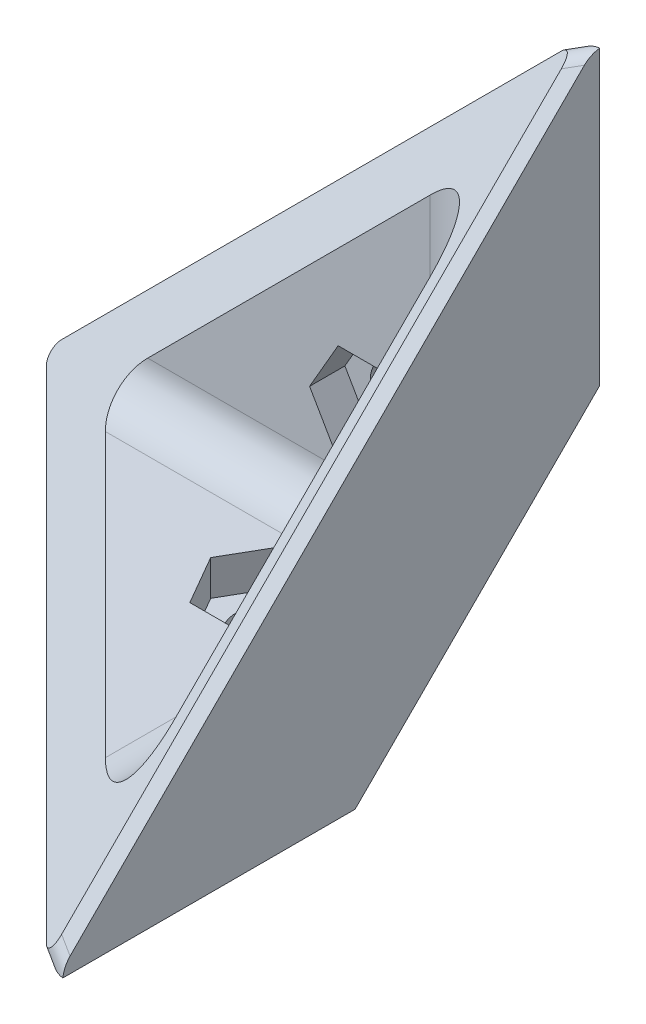
ISO-10303-21;
HEADER;
FILE_DESCRIPTION(('STEP AP214'),'2;1');
FILE_NAME('part.step','',(''),(''),'','','');
FILE_SCHEMA(('AUTOMOTIVE_DESIGN { 1 0 10303 214 1 1 1 1 }'));
ENDSEC;
DATA;
#1=APPLICATION_CONTEXT('core data for automotive mechanical design processes');
#2=APPLICATION_PROTOCOL_DEFINITION('international standard','automotive_design',2000,#1);
#3=PRODUCT_CONTEXT('',#1,'mechanical');
#4=PRODUCT('Part','Part','',(#3));
#5=PRODUCT_RELATED_PRODUCT_CATEGORY('part','',(#4));
#6=PRODUCT_DEFINITION_FORMATION('','',#4);
#7=PRODUCT_DEFINITION_CONTEXT('part definition',#1,'design');
#8=PRODUCT_DEFINITION('design','',#6,#7);
#9=PRODUCT_DEFINITION_SHAPE('','',#8);
#10=(LENGTH_UNIT() NAMED_UNIT(*) SI_UNIT(.MILLI.,.METRE.));
#11=(NAMED_UNIT(*) PLANE_ANGLE_UNIT() SI_UNIT($,.RADIAN.));
#12=(NAMED_UNIT(*) SI_UNIT($,.STERADIAN.) SOLID_ANGLE_UNIT());
#13=UNCERTAINTY_MEASURE_WITH_UNIT(LENGTH_MEASURE(1.E-05),#10,'distance_accuracy_value','');
#14=(GEOMETRIC_REPRESENTATION_CONTEXT(3) GLOBAL_UNCERTAINTY_ASSIGNED_CONTEXT((#13)) GLOBAL_UNIT_ASSIGNED_CONTEXT((#10,
#11,#12)) REPRESENTATION_CONTEXT('',''));
#15=CARTESIAN_POINT('',(0.,0.,0.));
#16=DIRECTION('',(0.,0.,1.));
#17=DIRECTION('',(1.,0.,0.));
#18=AXIS2_PLACEMENT_3D('',#15,#16,#17);
#19=CARTESIAN_POINT('',(-11.5,5.,12.));
#20=DIRECTION('',(0.,1.,0.));
#21=DIRECTION('',(0.,0.,1.));
#22=AXIS2_PLACEMENT_3D('',#19,#20,#21);
#23=CYLINDRICAL_SURFACE('',#22,2.25);
#24=CARTESIAN_POINT('',(-11.5,0.,12.));
#25=DIRECTION('',(0.,-1.,0.));
#26=DIRECTION('',(0.,0.,-1.));
#27=AXIS2_PLACEMENT_3D('',#24,#25,#26);
#28=CIRCLE('',#27,2.25);
#29=CARTESIAN_POINT('',(-11.5,0.,9.75));
#30=VERTEX_POINT('',#29);
#31=EDGE_CURVE('E291',#30,#30,#28,.T.);
#32=ORIENTED_EDGE('',*,*,#31,.T.);
#33=EDGE_LOOP('',(#32));
#34=FACE_BOUND('',#33,.T.);
#35=CARTESIAN_POINT('',(-11.5,2.5,12.));
#36=DIRECTION('',(0.,1.,0.));
#37=DIRECTION('',(0.,0.,1.));
#38=AXIS2_PLACEMENT_3D('',#35,#36,#37);
#39=CIRCLE('',#38,2.25);
#40=CARTESIAN_POINT('',(-11.5,2.5,14.25));
#41=VERTEX_POINT('',#40);
#42=EDGE_CURVE('E282',#41,#41,#39,.F.);
#43=ORIENTED_EDGE('',*,*,#42,.F.);
#44=EDGE_LOOP('',(#43));
#45=FACE_BOUND('',#44,.T.);
#46=ADVANCED_FACE('F52',(#34,#45),#23,.F.);
#47=CARTESIAN_POINT('',(-2.,0.,0.));
#48=DIRECTION('',(1.,0.,0.));
#49=DIRECTION('',(0.,0.,-1.));
#50=AXIS2_PLACEMENT_3D('',#47,#48,#49);
#51=PLANE('',#50);
#52=DIRECTION('',(0.,1.,0.));
#53=VECTOR('',#52,1.);
#54=CARTESIAN_POINT('',(-2.,13.7846096908265,10.));
#55=LINE('',#54,#53);
#56=CARTESIAN_POINT('',(-2.,28.,10.));
#57=VERTEX_POINT('',#56);
#58=CARTESIAN_POINT('',(-2.,10.,10.));
#59=VERTEX_POINT('',#58);
#60=EDGE_CURVE('E648',#57,#59,#55,.F.);
#61=ORIENTED_EDGE('',*,*,#60,.T.);
#62=DIRECTION('',(0.,0.,-1.));
#63=VECTOR('',#62,1.);
#64=CARTESIAN_POINT('',(-2.,10.,33.));
#65=LINE('',#64,#63);
#66=CARTESIAN_POINT('',(-2.,10.,28.));
#67=VERTEX_POINT('',#66);
#68=EDGE_CURVE('E647',#59,#67,#65,.F.);
#69=ORIENTED_EDGE('',*,*,#68,.T.);
#70=DIRECTION('',(0.,-0.707106781186548,0.707106781186547));
#71=VECTOR('',#70,1.);
#72=CARTESIAN_POINT('',(-2.,19.,19.));
#73=LINE('',#72,#71);
#74=EDGE_CURVE('E363',#57,#67,#73,.T.);
#75=ORIENTED_EDGE('',*,*,#74,.F.);
#76=EDGE_LOOP('',(#61,#69,#75));
#77=FACE_BOUND('',#76,.T.);
#78=ADVANCED_FACE('F458',(#77),#51,.F.);
#79=CARTESIAN_POINT('',(0.,0.,5.));
#80=DIRECTION('',(0.,0.,-1.));
#81=DIRECTION('',(-1.,0.,0.));
#82=AXIS2_PLACEMENT_3D('',#79,#80,#81);
#83=PLANE('',#82);
#84=DIRECTION('',(0.5,-0.866025403784439,0.));
#85=VECTOR('',#84,1.);
#86=CARTESIAN_POINT('',(-15.5414518843274,12.,5.));
#87=LINE('',#86,#85);
#88=CARTESIAN_POINT('',(-15.5414518843274,12.,5.));
#89=VERTEX_POINT('',#88);
#90=CARTESIAN_POINT('',(-13.5207259421637,8.5,5.));
#91=VERTEX_POINT('',#90);
#92=EDGE_CURVE('E331',#89,#91,#87,.T.);
#93=ORIENTED_EDGE('',*,*,#92,.F.);
#94=DIRECTION('',(-0.5,-0.866025403784439,0.));
#95=VECTOR('',#94,1.);
#96=CARTESIAN_POINT('',(-13.5207259421637,15.5,5.));
#97=LINE('',#96,#95);
#98=CARTESIAN_POINT('',(-13.5207259421637,15.5,5.));
#99=VERTEX_POINT('',#98);
#100=EDGE_CURVE('E315',#99,#89,#97,.T.);
#101=ORIENTED_EDGE('',*,*,#100,.F.);
#102=DIRECTION('',(-1.,0.,0.));
#103=VECTOR('',#102,1.);
#104=CARTESIAN_POINT('',(-9.47927405783631,15.5,5.));
#105=LINE('',#104,#103);
#106=CARTESIAN_POINT('',(-9.47927405783631,15.5,5.));
#107=VERTEX_POINT('',#106);
#108=EDGE_CURVE('E320',#107,#99,#105,.T.);
#109=ORIENTED_EDGE('',*,*,#108,.F.);
#110=DIRECTION('',(-0.5,0.866025403784439,0.));
#111=VECTOR('',#110,1.);
#112=CARTESIAN_POINT('',(-7.45854811567262,12.,5.));
#113=LINE('',#112,#111);
#114=CARTESIAN_POINT('',(-7.45854811567262,12.,5.));
#115=VERTEX_POINT('',#114);
#116=EDGE_CURVE('E345',#115,#107,#113,.T.);
#117=ORIENTED_EDGE('',*,*,#116,.F.);
#118=DIRECTION('',(0.5,0.866025403784439,0.));
#119=VECTOR('',#118,1.);
#120=CARTESIAN_POINT('',(-9.47927405783631,8.5,5.));
#121=LINE('',#120,#119);
#122=CARTESIAN_POINT('',(-9.47927405783631,8.5,5.));
#123=VERTEX_POINT('',#122);
#124=EDGE_CURVE('E338',#123,#115,#121,.T.);
#125=ORIENTED_EDGE('',*,*,#124,.F.);
#126=DIRECTION('',(1.,0.,0.));
#127=VECTOR('',#126,1.);
#128=CARTESIAN_POINT('',(-13.5207259421637,8.5,5.));
#129=LINE('',#128,#127);
#130=EDGE_CURVE('E340',#91,#123,#129,.T.);
#131=ORIENTED_EDGE('',*,*,#130,.F.);
#132=EDGE_LOOP('',(#93,#101,#109,#117,#125,#131));
#133=FACE_BOUND('',#132,.T.);
#134=DIRECTION('',(-0.707106781186548,-0.707106781186548,0.));
#135=VECTOR('',#134,1.);
#136=CARTESIAN_POINT('',(2.50000000000001,37.5,5.));
#137=LINE('',#136,#135);
#138=CARTESIAN_POINT('',(-7.,28.,5.));
#139=VERTEX_POINT('',#138);
#140=CARTESIAN_POINT('',(-27.,8.,5.));
#141=VERTEX_POINT('',#140);
#142=EDGE_CURVE('E349',#139,#141,#137,.T.);
#143=ORIENTED_EDGE('',*,*,#142,.T.);
#144=DIRECTION('',(1.,0.,0.));
#145=VECTOR('',#144,1.);
#146=CARTESIAN_POINT('',(-10.7846096908265,8.,5.));
#147=LINE('',#146,#145);
#148=CARTESIAN_POINT('',(-7.78460969082653,8.,5.));
#149=VERTEX_POINT('',#148);
#150=EDGE_CURVE('E634',#141,#149,#147,.T.);
#151=ORIENTED_EDGE('',*,*,#150,.T.);
#152=DIRECTION('',(-0.707106781186548,-0.707106781186548,0.));
#153=VECTOR('',#152,1.);
#154=CARTESIAN_POINT('',(-7.89230484541326,7.89230484541326,5.));
#155=LINE('',#154,#153);
#156=CARTESIAN_POINT('',(-7.,8.78460969082653,5.));
#157=VERTEX_POINT('',#156);
#158=EDGE_CURVE('E293',#157,#149,#155,.T.);
#159=ORIENTED_EDGE('',*,*,#158,.F.);
#160=DIRECTION('',(0.,1.,0.));
#161=VECTOR('',#160,1.);
#162=CARTESIAN_POINT('',(-7.,33.,5.));
#163=LINE('',#162,#161);
#164=EDGE_CURVE('E644',#157,#139,#163,.T.);
#165=ORIENTED_EDGE('',*,*,#164,.T.);
#166=EDGE_LOOP('',(#143,#151,#159,#165));
#167=FACE_BOUND('',#166,.T.);
#168=ADVANCED_FACE('F453',(#133,#167),#83,.F.);
#169=CARTESIAN_POINT('',(-40.,5.,0.));
#170=DIRECTION('',(0.,-1.,0.));
#171=DIRECTION('',(1.,0.,0.));
#172=AXIS2_PLACEMENT_3D('',#169,#170,#171);
#173=PLANE('',#172);
#174=DIRECTION('',(0.500000000000001,0.,0.866025403784438));
#175=VECTOR('',#174,1.);
#176=CARTESIAN_POINT('',(-15.5414518843274,5.,12.));
#177=LINE('',#176,#175);
#178=CARTESIAN_POINT('',(-15.5414518843274,5.,12.));
#179=VERTEX_POINT('',#178);
#180=CARTESIAN_POINT('',(-13.5207259421637,5.,15.5));
#181=VERTEX_POINT('',#180);
#182=EDGE_CURVE('E268',#179,#181,#177,.T.);
#183=ORIENTED_EDGE('',*,*,#182,.F.);
#184=DIRECTION('',(-0.5,0.,0.866025403784438));
#185=VECTOR('',#184,1.);
#186=CARTESIAN_POINT('',(-13.5207259421637,5.,8.5));
#187=LINE('',#186,#185);
#188=CARTESIAN_POINT('',(-13.5207259421637,5.,8.5));
#189=VERTEX_POINT('',#188);
#190=EDGE_CURVE('E240',#189,#179,#187,.T.);
#191=ORIENTED_EDGE('',*,*,#190,.F.);
#192=DIRECTION('',(-1.,0.,0.));
#193=VECTOR('',#192,1.);
#194=CARTESIAN_POINT('',(-9.47927405783631,5.,8.5));
#195=LINE('',#194,#193);
#196=CARTESIAN_POINT('',(-9.47927405783631,5.,8.5));
#197=VERTEX_POINT('',#196);
#198=EDGE_CURVE('E257',#197,#189,#195,.T.);
#199=ORIENTED_EDGE('',*,*,#198,.F.);
#200=DIRECTION('',(-0.5,0.,-0.866025403784438));
#201=VECTOR('',#200,1.);
#202=CARTESIAN_POINT('',(-7.45854811567262,5.,12.));
#203=LINE('',#202,#201);
#204=CARTESIAN_POINT('',(-7.45854811567262,5.,12.));
#205=VERTEX_POINT('',#204);
#206=EDGE_CURVE('E256',#205,#197,#203,.T.);
#207=ORIENTED_EDGE('',*,*,#206,.F.);
#208=DIRECTION('',(0.5,0.,-0.866025403784439));
#209=VECTOR('',#208,1.);
#210=CARTESIAN_POINT('',(-9.47927405783631,5.,15.5));
#211=LINE('',#210,#209);
#212=CARTESIAN_POINT('',(-9.47927405783631,5.,15.5));
#213=VERTEX_POINT('',#212);
#214=EDGE_CURVE('E277',#213,#205,#211,.T.);
#215=ORIENTED_EDGE('',*,*,#214,.F.);
#216=DIRECTION('',(1.,0.,0.));
#217=VECTOR('',#216,1.);
#218=CARTESIAN_POINT('',(-13.5207259421637,5.,15.5));
#219=LINE('',#218,#217);
#220=EDGE_CURVE('E271',#181,#213,#219,.T.);
#221=ORIENTED_EDGE('',*,*,#220,.F.);
#222=EDGE_LOOP('',(#183,#191,#199,#207,#215,#221));
#223=FACE_BOUND('',#222,.T.);
#224=DIRECTION('',(0.707106781186548,0.,0.707106781186547));
#225=VECTOR('',#224,1.);
#226=CARTESIAN_POINT('',(-27.8923048454133,5.,-12.1076951545867));
#227=LINE('',#226,#225);
#228=CARTESIAN_POINT('',(-7.78460969082652,5.,8.));
#229=VERTEX_POINT('',#228);
#230=CARTESIAN_POINT('',(-7.,5.,8.78460969082652));
#231=VERTEX_POINT('',#230);
#232=EDGE_CURVE('E668',#229,#231,#227,.T.);
#233=ORIENTED_EDGE('',*,*,#232,.F.);
#234=DIRECTION('',(1.,0.,0.));
#235=VECTOR('',#234,1.);
#236=CARTESIAN_POINT('',(-30.,5.,8.));
#237=LINE('',#236,#235);
#238=CARTESIAN_POINT('',(-27.,5.,8.));
#239=VERTEX_POINT('',#238);
#240=EDGE_CURVE('E62',#229,#239,#237,.F.);
#241=ORIENTED_EDGE('',*,*,#240,.T.);
#242=DIRECTION('',(0.707106781186548,0.,0.707106781186547));
#243=VECTOR('',#242,1.);
#244=CARTESIAN_POINT('',(-17.5,5.,17.5));
#245=LINE('',#244,#243);
#246=CARTESIAN_POINT('',(-7.,5.,28.));
#247=VERTEX_POINT('',#246);
#248=EDGE_CURVE('E362',#239,#247,#245,.T.);
#249=ORIENTED_EDGE('',*,*,#248,.T.);
#250=DIRECTION('',(0.,0.,-1.));
#251=VECTOR('',#250,1.);
#252=CARTESIAN_POINT('',(-7.,5.,13.7846096908265));
#253=LINE('',#252,#251);
#254=EDGE_CURVE('E669',#247,#231,#253,.T.);
#255=ORIENTED_EDGE('',*,*,#254,.T.);
#256=EDGE_LOOP('',(#233,#241,#249,#255));
#257=FACE_BOUND('',#256,.T.);
#258=ADVANCED_FACE('F399',(#223,#257),#173,.F.);
#259=CARTESIAN_POINT('',(0.,0.,0.));
#260=DIRECTION('',(1.,0.,0.));
#261=DIRECTION('',(0.,0.,-1.));
#262=AXIS2_PLACEMENT_3D('',#259,#260,#261);
#263=PLANE('',#262);
#264=DIRECTION('',(0.,-0.707106781186548,0.707106781186547));
#265=VECTOR('',#264,1.);
#266=CARTESIAN_POINT('',(0.,19.2928932188134,19.2928932188134));
#267=LINE('',#266,#265);
#268=CARTESIAN_POINT('',(0.,37.4981225640463,1.08766387358053));
#269=VERTEX_POINT('',#268);
#270=CARTESIAN_POINT('',(0.,1.08766387358053,37.4981225640463));
#271=VERTEX_POINT('',#270);
#272=EDGE_CURVE('E699',#269,#271,#267,.T.);
#273=ORIENTED_EDGE('',*,*,#272,.T.);
#274=CARTESIAN_POINT('',(0.,0.,36.9933360035906));
#275=DIRECTION('',(1.,0.,0.));
#276=DIRECTION('',(0.,0.965925826289069,-0.258819045102518));
#277=AXIS2_PLACEMENT_3D('',#274,#275,#276);
#278=ELLIPSE('',#277,1.43937374219641,1.);
#279=CARTESIAN_POINT('',(0.,0.,38.0111269373595));
#280=VERTEX_POINT('',#279);
#281=EDGE_CURVE('E429',#271,#280,#278,.T.);
#282=ORIENTED_EDGE('',*,*,#281,.T.);
#283=DIRECTION('',(0.,0.,-1.));
#284=VECTOR('',#283,1.);
#285=CARTESIAN_POINT('',(0.,0.,40.));
#286=LINE('',#285,#284);
#287=CARTESIAN_POINT('',(0.,0.,17.3205080756888));
#288=VERTEX_POINT('',#287);
#289=EDGE_CURVE('E418',#280,#288,#286,.T.);
#290=ORIENTED_EDGE('',*,*,#289,.T.);
#291=DIRECTION('',(0.,-0.707106781186548,0.707106781186547));
#292=VECTOR('',#291,1.);
#293=CARTESIAN_POINT('',(0.,8.66025403784438,8.66025403784439));
#294=LINE('',#293,#292);
#295=CARTESIAN_POINT('',(0.,17.3205080756888,0.));
#296=VERTEX_POINT('',#295);
#297=EDGE_CURVE('E301',#296,#288,#294,.T.);
#298=ORIENTED_EDGE('',*,*,#297,.F.);
#299=DIRECTION('',(0.,1.,0.));
#300=VECTOR('',#299,1.);
#301=CARTESIAN_POINT('',(0.,0.,0.));
#302=LINE('',#301,#300);
#303=CARTESIAN_POINT('',(0.,38.0111269373596,0.));
#304=VERTEX_POINT('',#303);
#305=EDGE_CURVE('E684',#296,#304,#302,.T.);
#306=ORIENTED_EDGE('',*,*,#305,.T.);
#307=CARTESIAN_POINT('',(0.,36.9933360035906,0.));
#308=DIRECTION('',(1.,0.,0.));
#309=DIRECTION('',(0.,-0.258819045102517,0.96592582628907));
#310=AXIS2_PLACEMENT_3D('',#307,#308,#309);
#311=ELLIPSE('',#310,1.43937374219641,1.);
#312=EDGE_CURVE('E430',#304,#269,#311,.T.);
#313=ORIENTED_EDGE('',*,*,#312,.T.);
#314=EDGE_LOOP('',(#273,#282,#290,#298,#306,#313));
#315=FACE_BOUND('',#314,.T.);
#316=ADVANCED_FACE('F391',(#315),#263,.T.);
#317=CARTESIAN_POINT('',(0.,0.,0.));
#318=DIRECTION('',(0.,0.,-1.));
#319=DIRECTION('',(-1.,0.,0.));
#320=AXIS2_PLACEMENT_3D('',#317,#318,#319);
#321=PLANE('',#320);
#322=DIRECTION('',(1.,0.,0.));
#323=VECTOR('',#322,1.);
#324=CARTESIAN_POINT('',(0.,0.,0.));
#325=LINE('',#324,#323);
#326=CARTESIAN_POINT('',(-38.0111269373596,0.,0.));
#327=VERTEX_POINT('',#326);
#328=CARTESIAN_POINT('',(-17.3205080756888,0.,0.));
#329=VERTEX_POINT('',#328);
#330=EDGE_CURVE('E364',#327,#329,#325,.T.);
#331=ORIENTED_EDGE('',*,*,#330,.F.);
#332=CARTESIAN_POINT('',(-36.9933360035906,0.,0.));
#333=DIRECTION('',(0.,0.,-1.));
#334=DIRECTION('',(-0.258819045102525,-0.965925826289067,0.));
#335=AXIS2_PLACEMENT_3D('',#332,#333,#334);
#336=ELLIPSE('',#335,1.43937374219641,1.);
#337=CARTESIAN_POINT('',(-37.4981225640464,1.08766387358053,0.));
#338=VERTEX_POINT('',#337);
#339=EDGE_CURVE('E686',#327,#338,#336,.T.);
#340=ORIENTED_EDGE('',*,*,#339,.T.);
#341=DIRECTION('',(0.707106781186548,0.707106781186548,0.));
#342=VECTOR('',#341,1.);
#343=CARTESIAN_POINT('',(-19.2928932188134,19.2928932188134,0.));
#344=LINE('',#343,#342);
#345=CARTESIAN_POINT('',(-1.08766387358054,37.4981225640463,0.));
#346=VERTEX_POINT('',#345);
#347=EDGE_CURVE('E694',#338,#346,#344,.T.);
#348=ORIENTED_EDGE('',*,*,#347,.T.);
#349=CARTESIAN_POINT('',(0.,36.9933360035906,0.));
#350=DIRECTION('',(0.,0.,-1.));
#351=DIRECTION('',(-0.965925826289069,-0.258819045102518,0.));
#352=AXIS2_PLACEMENT_3D('',#349,#350,#351);
#353=ELLIPSE('',#352,1.4393737421964,1.);
#354=EDGE_CURVE('E695',#346,#304,#353,.T.);
#355=ORIENTED_EDGE('',*,*,#354,.T.);
#356=ORIENTED_EDGE('',*,*,#305,.F.);
#357=DIRECTION('',(0.707106781186548,0.707106781186548,0.));
#358=VECTOR('',#357,1.);
#359=CARTESIAN_POINT('',(-8.66025403784439,8.66025403784439,0.));
#360=LINE('',#359,#358);
#361=EDGE_CURVE('E300',#329,#296,#360,.T.);
#362=ORIENTED_EDGE('',*,*,#361,.F.);
#363=EDGE_LOOP('',(#331,#340,#348,#355,#356,#362));
#364=FACE_BOUND('',#363,.T.);
#365=CARTESIAN_POINT('',(-11.5,12.,0.));
#366=DIRECTION('',(0.,0.,-1.));
#367=DIRECTION('',(-1.,0.,0.));
#368=AXIS2_PLACEMENT_3D('',#365,#366,#367);
#369=CIRCLE('',#368,2.25);
#370=CARTESIAN_POINT('',(-13.75,12.,0.));
#371=VERTEX_POINT('',#370);
#372=EDGE_CURVE('E307',#371,#371,#369,.T.);
#373=ORIENTED_EDGE('',*,*,#372,.F.);
#374=EDGE_LOOP('',(#373));
#375=FACE_BOUND('',#374,.T.);
#376=ADVANCED_FACE('F397',(#364,#375),#321,.T.);
#377=CARTESIAN_POINT('',(0.,40.,0.));
#378=DIRECTION('',(-0.577350269189626,0.577350269189626,0.577350269189626));
#379=DIRECTION('',(-0.707106781186547,-0.707106781186547,0.));
#380=AXIS2_PLACEMENT_3D('',#377,#378,#379);
#381=PLANE('',#380);
#382=DIRECTION('',(0.707106781186548,0.,0.707106781186547));
#383=VECTOR('',#382,1.);
#384=CARTESIAN_POINT('',(-19.5917517095361,0.816496580927736,19.5917517095361));
#385=LINE('',#384,#383);
#386=CARTESIAN_POINT('',(-37.279342964564,0.816496580927736,1.90416045450827));
#387=VERTEX_POINT('',#386);
#388=CARTESIAN_POINT('',(-1.90416045450827,0.816496580927736,37.279342964564));
#389=VERTEX_POINT('',#388);
#390=EDGE_CURVE('E712',#387,#389,#385,.T.);
#391=ORIENTED_EDGE('',*,*,#390,.T.);
#392=CARTESIAN_POINT('',(-1.7358982676897,1.73589826768971,36.5282034646206));
#393=DIRECTION('',(-0.577350269189626,0.577350269189626,0.577350269189626));
#394=DIRECTION('',(-0.408248290463858,0.408248290463868,-0.816496580927726));
#395=AXIS2_PLACEMENT_3D('',#392,#393,#394);
#396=ELLIPSE('',#395,1.43937374219641,1.);
#397=CARTESIAN_POINT('',(-0.816496580927736,1.90416045450828,37.279342964564));
#398=VERTEX_POINT('',#397);
#399=EDGE_CURVE('E736',#389,#398,#396,.T.);
#400=ORIENTED_EDGE('',*,*,#399,.T.);
#401=DIRECTION('',(0.,0.707106781186548,-0.707106781186547));
#402=VECTOR('',#401,1.);
#403=CARTESIAN_POINT('',(-0.816496580927736,39.5917517095361,-0.408248290463872));
#404=LINE('',#403,#402);
#405=CARTESIAN_POINT('',(-0.816496580927736,37.279342964564,1.90416045450828));
#406=VERTEX_POINT('',#405);
#407=EDGE_CURVE('E720',#398,#406,#404,.T.);
#408=ORIENTED_EDGE('',*,*,#407,.T.);
#409=CARTESIAN_POINT('',(-1.7358982676897,36.5282034646206,1.7358982676897));
#410=DIRECTION('',(-0.577350269189626,0.577350269189626,0.577350269189626));
#411=DIRECTION('',(-0.40824829046386,-0.816496580927726,0.408248290463866));
#412=AXIS2_PLACEMENT_3D('',#409,#410,#411);
#413=ELLIPSE('',#412,1.4393737421964,1.);
#414=CARTESIAN_POINT('',(-1.90416045450827,37.279342964564,0.816496580927736));
#415=VERTEX_POINT('',#414);
#416=EDGE_CURVE('E735',#406,#415,#413,.T.);
#417=ORIENTED_EDGE('',*,*,#416,.T.);
#418=DIRECTION('',(-0.707106781186548,-0.707106781186548,0.));
#419=VECTOR('',#418,1.);
#420=CARTESIAN_POINT('',(0.408248290463875,39.5917517095361,0.816496580927736));
#421=LINE('',#420,#419);
#422=CARTESIAN_POINT('',(-37.279342964564,1.90416045450827,0.816496580927736));
#423=VERTEX_POINT('',#422);
#424=EDGE_CURVE('E719',#415,#423,#421,.T.);
#425=ORIENTED_EDGE('',*,*,#424,.T.);
#426=CARTESIAN_POINT('',(-36.5282034646206,1.73589826768971,1.7358982676897));
#427=DIRECTION('',(-0.577350269189626,0.577350269189626,0.577350269189626));
#428=DIRECTION('',(-0.816496580927726,-0.408248290463865,-0.408248290463861));
#429=AXIS2_PLACEMENT_3D('',#426,#427,#428);
#430=ELLIPSE('',#429,1.43937374219641,1.);
#431=EDGE_CURVE('E740',#423,#387,#430,.T.);
#432=ORIENTED_EDGE('',*,*,#431,.T.);
#433=EDGE_LOOP('',(#391,#400,#408,#417,#425,#432));
#434=FACE_BOUND('',#433,.T.);
#435=ORIENTED_EDGE('',*,*,#142,.F.);
#436=CARTESIAN_POINT('',(-7.,23.,10.));
#437=DIRECTION('',(-0.577350269189626,0.577350269189626,0.577350269189626));
#438=DIRECTION('',(-0.408248290463863,-0.816496580927726,0.408248290463863));
#439=AXIS2_PLACEMENT_3D('',#436,#437,#438);
#440=ELLIPSE('',#439,8.66025403784439,5.);
#441=EDGE_CURVE('E650',#139,#57,#440,.F.);
#442=ORIENTED_EDGE('',*,*,#441,.T.);
#443=ORIENTED_EDGE('',*,*,#74,.T.);
#444=CARTESIAN_POINT('',(-7.,10.,23.));
#445=DIRECTION('',(-0.577350269189626,0.577350269189626,0.577350269189626));
#446=DIRECTION('',(0.408248290463863,-0.408248290463863,0.816496580927726));
#447=AXIS2_PLACEMENT_3D('',#444,#445,#446);
#448=ELLIPSE('',#447,8.66025403784438,5.);
#449=EDGE_CURVE('E643',#67,#247,#448,.F.);
#450=ORIENTED_EDGE('',*,*,#449,.T.);
#451=ORIENTED_EDGE('',*,*,#248,.F.);
#452=CARTESIAN_POINT('',(-24.,8.,8.));
#453=DIRECTION('',(-0.577350269189626,0.577350269189626,0.577350269189626));
#454=DIRECTION('',(-0.816496580927726,-0.408248290463863,-0.408248290463863));
#455=AXIS2_PLACEMENT_3D('',#452,#453,#454);
#456=ELLIPSE('',#455,5.19615242270663,3.);
#457=EDGE_CURVE('E12',#239,#141,#456,.F.);
#458=ORIENTED_EDGE('',*,*,#457,.T.);
#459=EDGE_LOOP('',(#435,#442,#443,#450,#451,#458));
#460=FACE_BOUND('',#459,.T.);
#461=ADVANCED_FACE('F390',(#434,#460),#381,.T.);
#462=CARTESIAN_POINT('',(-40.,0.,0.));
#463=DIRECTION('',(0.,-1.,0.));
#464=DIRECTION('',(1.,0.,0.));
#465=AXIS2_PLACEMENT_3D('',#462,#463,#464);
#466=PLANE('',#465);
#467=ORIENTED_EDGE('',*,*,#31,.F.);
#468=EDGE_LOOP('',(#467));
#469=FACE_BOUND('',#468,.T.);
#470=ORIENTED_EDGE('',*,*,#289,.F.);
#471=CARTESIAN_POINT('',(0.,0.,36.9933360035906));
#472=DIRECTION('',(0.,-1.,0.));
#473=DIRECTION('',(-0.965925826289068,0.,-0.258819045102521));
#474=AXIS2_PLACEMENT_3D('',#471,#472,#473);
#475=ELLIPSE('',#474,1.4393737421964,1.);
#476=CARTESIAN_POINT('',(-1.08766387358052,0.,37.4981225640463));
#477=VERTEX_POINT('',#476);
#478=EDGE_CURVE('E692',#280,#477,#475,.T.);
#479=ORIENTED_EDGE('',*,*,#478,.T.);
#480=DIRECTION('',(-0.707106781186548,0.,-0.707106781186547));
#481=VECTOR('',#480,1.);
#482=CARTESIAN_POINT('',(-39.2928932188134,0.,-0.707106781186557));
#483=LINE('',#482,#481);
#484=CARTESIAN_POINT('',(-37.4981225640464,0.,1.08766387358053));
#485=VERTEX_POINT('',#484);
#486=EDGE_CURVE('E709',#477,#485,#483,.T.);
#487=ORIENTED_EDGE('',*,*,#486,.T.);
#488=CARTESIAN_POINT('',(-36.9933360035906,0.,0.));
#489=DIRECTION('',(0.,-1.,0.));
#490=DIRECTION('',(-0.258819045102526,0.,-0.965925826289067));
#491=AXIS2_PLACEMENT_3D('',#488,#489,#490);
#492=ELLIPSE('',#491,1.43937374219641,1.);
#493=EDGE_CURVE('E431',#485,#327,#492,.T.);
#494=ORIENTED_EDGE('',*,*,#493,.T.);
#495=ORIENTED_EDGE('',*,*,#330,.T.);
#496=DIRECTION('',(-0.707106781186548,0.,-0.707106781186547));
#497=VECTOR('',#496,1.);
#498=CARTESIAN_POINT('',(-28.6602540378444,0.,-11.3397459621556));
#499=LINE('',#498,#497);
#500=EDGE_CURVE('E295',#288,#329,#499,.T.);
#501=ORIENTED_EDGE('',*,*,#500,.F.);
#502=EDGE_LOOP('',(#470,#479,#487,#494,#495,#501));
#503=FACE_BOUND('',#502,.T.);
#504=ADVANCED_FACE('F380',(#469,#503),#466,.T.);
#505=CARTESIAN_POINT('',(-13.5207259421637,15.5,2.5));
#506=DIRECTION('',(-0.866025403784439,0.5,0.));
#507=DIRECTION('',(-0.5,-0.866025403784439,0.));
#508=AXIS2_PLACEMENT_3D('',#505,#506,#507);
#509=PLANE('',#508);
#510=ORIENTED_EDGE('',*,*,#100,.T.);
#511=DIRECTION('',(0.,0.,1.));
#512=VECTOR('',#511,1.);
#513=CARTESIAN_POINT('',(-15.5414518843274,12.,2.5));
#514=LINE('',#513,#512);
#515=CARTESIAN_POINT('',(-15.5414518843274,12.,2.5));
#516=VERTEX_POINT('',#515);
#517=EDGE_CURVE('E334',#516,#89,#514,.T.);
#518=ORIENTED_EDGE('',*,*,#517,.F.);
#519=DIRECTION('',(-0.5,-0.866025403784439,0.));
#520=VECTOR('',#519,1.);
#521=CARTESIAN_POINT('',(-13.5207259421637,15.5,2.5));
#522=LINE('',#521,#520);
#523=CARTESIAN_POINT('',(-13.5207259421637,15.5,2.5));
#524=VERTEX_POINT('',#523);
#525=EDGE_CURVE('E312',#524,#516,#522,.T.);
#526=ORIENTED_EDGE('',*,*,#525,.F.);
#527=DIRECTION('',(0.,0.,1.));
#528=VECTOR('',#527,1.);
#529=CARTESIAN_POINT('',(-13.5207259421637,15.5,2.5));
#530=LINE('',#529,#528);
#531=EDGE_CURVE('E347',#524,#99,#530,.T.);
#532=ORIENTED_EDGE('',*,*,#531,.T.);
#533=EDGE_LOOP('',(#510,#518,#526,#532));
#534=FACE_BOUND('',#533,.T.);
#535=ADVANCED_FACE('F389',(#534),#509,.F.);
#536=CARTESIAN_POINT('',(-9.47927405783631,15.5,2.5));
#537=DIRECTION('',(0.,1.,0.));
#538=DIRECTION('',(-1.,0.,0.));
#539=AXIS2_PLACEMENT_3D('',#536,#537,#538);
#540=PLANE('',#539);
#541=ORIENTED_EDGE('',*,*,#108,.T.);
#542=ORIENTED_EDGE('',*,*,#531,.F.);
#543=DIRECTION('',(-1.,0.,0.));
#544=VECTOR('',#543,1.);
#545=CARTESIAN_POINT('',(-9.47927405783631,15.5,2.5));
#546=LINE('',#545,#544);
#547=CARTESIAN_POINT('',(-9.47927405783631,15.5,2.5));
#548=VERTEX_POINT('',#547);
#549=EDGE_CURVE('E328',#548,#524,#546,.T.);
#550=ORIENTED_EDGE('',*,*,#549,.F.);
#551=DIRECTION('',(0.,0.,1.));
#552=VECTOR('',#551,1.);
#553=CARTESIAN_POINT('',(-9.47927405783631,15.5,2.5));
#554=LINE('',#553,#552);
#555=EDGE_CURVE('E352',#548,#107,#554,.T.);
#556=ORIENTED_EDGE('',*,*,#555,.T.);
#557=EDGE_LOOP('',(#541,#542,#550,#556));
#558=FACE_BOUND('',#557,.T.);
#559=ADVANCED_FACE('F467',(#558),#540,.F.);
#560=CARTESIAN_POINT('',(-7.45854811567262,12.,2.5));
#561=DIRECTION('',(0.866025403784438,0.5,0.));
#562=DIRECTION('',(-0.5,0.866025403784439,0.));
#563=AXIS2_PLACEMENT_3D('',#560,#561,#562);
#564=PLANE('',#563);
#565=ORIENTED_EDGE('',*,*,#116,.T.);
#566=ORIENTED_EDGE('',*,*,#555,.F.);
#567=DIRECTION('',(-0.5,0.866025403784439,0.));
#568=VECTOR('',#567,1.);
#569=CARTESIAN_POINT('',(-7.45854811567262,12.,2.5));
#570=LINE('',#569,#568);
#571=CARTESIAN_POINT('',(-7.45854811567262,12.,2.5));
#572=VERTEX_POINT('',#571);
#573=EDGE_CURVE('E326',#572,#548,#570,.T.);
#574=ORIENTED_EDGE('',*,*,#573,.F.);
#575=DIRECTION('',(0.,0.,1.));
#576=VECTOR('',#575,1.);
#577=CARTESIAN_POINT('',(-7.45854811567262,12.,2.5));
#578=LINE('',#577,#576);
#579=EDGE_CURVE('E355',#572,#115,#578,.T.);
#580=ORIENTED_EDGE('',*,*,#579,.T.);
#581=EDGE_LOOP('',(#565,#566,#574,#580));
#582=FACE_BOUND('',#581,.T.);
#583=ADVANCED_FACE('F479',(#582),#564,.F.);
#584=CARTESIAN_POINT('',(-9.47927405783631,8.5,2.5));
#585=DIRECTION('',(0.866025403784439,-0.5,0.));
#586=DIRECTION('',(0.5,0.866025403784439,0.));
#587=AXIS2_PLACEMENT_3D('',#584,#585,#586);
#588=PLANE('',#587);
#589=ORIENTED_EDGE('',*,*,#124,.T.);
#590=ORIENTED_EDGE('',*,*,#579,.F.);
#591=DIRECTION('',(0.5,0.866025403784439,0.));
#592=VECTOR('',#591,1.);
#593=CARTESIAN_POINT('',(-9.47927405783631,8.5,2.5));
#594=LINE('',#593,#592);
#595=CARTESIAN_POINT('',(-9.47927405783631,8.5,2.5));
#596=VERTEX_POINT('',#595);
#597=EDGE_CURVE('E325',#596,#572,#594,.T.);
#598=ORIENTED_EDGE('',*,*,#597,.F.);
#599=DIRECTION('',(0.,0.,1.));
#600=VECTOR('',#599,1.);
#601=CARTESIAN_POINT('',(-9.47927405783631,8.5,2.5));
#602=LINE('',#601,#600);
#603=EDGE_CURVE('E353',#596,#123,#602,.T.);
#604=ORIENTED_EDGE('',*,*,#603,.T.);
#605=EDGE_LOOP('',(#589,#590,#598,#604));
#606=FACE_BOUND('',#605,.T.);
#607=ADVANCED_FACE('F476',(#606),#588,.F.);
#608=CARTESIAN_POINT('',(-13.5207259421637,8.5,2.5));
#609=DIRECTION('',(0.,-1.,0.));
#610=DIRECTION('',(1.,0.,0.));
#611=AXIS2_PLACEMENT_3D('',#608,#609,#610);
#612=PLANE('',#611);
#613=ORIENTED_EDGE('',*,*,#130,.T.);
#614=ORIENTED_EDGE('',*,*,#603,.F.);
#615=DIRECTION('',(1.,0.,0.));
#616=VECTOR('',#615,1.);
#617=CARTESIAN_POINT('',(-13.5207259421637,8.5,2.5));
#618=LINE('',#617,#616);
#619=CARTESIAN_POINT('',(-13.5207259421637,8.5,2.5));
#620=VERTEX_POINT('',#619);
#621=EDGE_CURVE('E318',#620,#596,#618,.T.);
#622=ORIENTED_EDGE('',*,*,#621,.F.);
#623=DIRECTION('',(0.,0.,1.));
#624=VECTOR('',#623,1.);
#625=CARTESIAN_POINT('',(-13.5207259421637,8.5,2.5));
#626=LINE('',#625,#624);
#627=EDGE_CURVE('E357',#620,#91,#626,.T.);
#628=ORIENTED_EDGE('',*,*,#627,.T.);
#629=EDGE_LOOP('',(#613,#614,#622,#628));
#630=FACE_BOUND('',#629,.T.);
#631=ADVANCED_FACE('F474',(#630),#612,.F.);
#632=CARTESIAN_POINT('',(-15.5414518843274,12.,2.5));
#633=DIRECTION('',(-0.866025403784439,-0.5,0.));
#634=DIRECTION('',(0.5,-0.866025403784439,0.));
#635=AXIS2_PLACEMENT_3D('',#632,#633,#634);
#636=PLANE('',#635);
#637=ORIENTED_EDGE('',*,*,#92,.T.);
#638=ORIENTED_EDGE('',*,*,#627,.F.);
#639=DIRECTION('',(0.5,-0.866025403784439,0.));
#640=VECTOR('',#639,1.);
#641=CARTESIAN_POINT('',(-15.5414518843274,12.,2.5));
#642=LINE('',#641,#640);
#643=EDGE_CURVE('E317',#516,#620,#642,.T.);
#644=ORIENTED_EDGE('',*,*,#643,.F.);
#645=ORIENTED_EDGE('',*,*,#517,.T.);
#646=EDGE_LOOP('',(#637,#638,#644,#645));
#647=FACE_BOUND('',#646,.T.);
#648=ADVANCED_FACE('F466',(#647),#636,.F.);
#649=CARTESIAN_POINT('',(0.,0.,2.5));
#650=DIRECTION('',(0.,0.,1.));
#651=DIRECTION('',(1.,0.,0.));
#652=AXIS2_PLACEMENT_3D('',#649,#650,#651);
#653=PLANE('',#652);
#654=CARTESIAN_POINT('',(-11.5,12.,2.5));
#655=DIRECTION('',(0.,0.,1.));
#656=DIRECTION('',(1.,0.,0.));
#657=AXIS2_PLACEMENT_3D('',#654,#655,#656);
#658=CIRCLE('',#657,2.25);
#659=CARTESIAN_POINT('',(-9.25,12.,2.5));
#660=VERTEX_POINT('',#659);
#661=EDGE_CURVE('E306',#660,#660,#658,.T.);
#662=ORIENTED_EDGE('',*,*,#661,.F.);
#663=EDGE_LOOP('',(#662));
#664=FACE_BOUND('',#663,.T.);
#665=ORIENTED_EDGE('',*,*,#525,.T.);
#666=ORIENTED_EDGE('',*,*,#643,.T.);
#667=ORIENTED_EDGE('',*,*,#621,.T.);
#668=ORIENTED_EDGE('',*,*,#597,.T.);
#669=ORIENTED_EDGE('',*,*,#573,.T.);
#670=ORIENTED_EDGE('',*,*,#549,.T.);
#671=EDGE_LOOP('',(#665,#666,#667,#668,#669,#670));
#672=FACE_BOUND('',#671,.T.);
#673=ADVANCED_FACE('F472',(#664,#672),#653,.T.);
#674=CARTESIAN_POINT('',(-11.5,12.,5.));
#675=DIRECTION('',(0.,0.,1.));
#676=DIRECTION('',(1.,0.,0.));
#677=AXIS2_PLACEMENT_3D('',#674,#675,#676);
#678=CYLINDRICAL_SURFACE('',#677,2.25);
#679=ORIENTED_EDGE('',*,*,#372,.T.);
#680=EDGE_LOOP('',(#679));
#681=FACE_BOUND('',#680,.T.);
#682=ORIENTED_EDGE('',*,*,#661,.T.);
#683=EDGE_LOOP('',(#682));
#684=FACE_BOUND('',#683,.T.);
#685=ADVANCED_FACE('F489',(#681,#684),#678,.F.);
#686=CARTESIAN_POINT('',(-5.77350269189626,5.77350269189626,5.77350269189626));
#687=DIRECTION('',(-0.577350269189626,0.577350269189626,0.577350269189626));
#688=DIRECTION('',(0.707106781186548,0.,0.707106781186547));
#689=AXIS2_PLACEMENT_3D('',#686,#687,#688);
#690=PLANE('',#689);
#691=ORIENTED_EDGE('',*,*,#297,.T.);
#692=ORIENTED_EDGE('',*,*,#500,.T.);
#693=ORIENTED_EDGE('',*,*,#361,.T.);
#694=EDGE_LOOP('',(#691,#692,#693));
#695=FACE_BOUND('',#694,.T.);
#696=ADVANCED_FACE('F494',(#695),#690,.F.);
#697=CARTESIAN_POINT('',(0.408248290463875,39.5917517095361,0.816496580927736));
#698=DIRECTION('',(0.627963030199555,-0.627963030199555,0.459700843380982));
#699=DIRECTION('',(-0.707106781186548,-0.707106781186548,0.));
#700=AXIS2_PLACEMENT_3D('',#697,#698,#699);
#701=PLANE('',#700);
#702=ORIENTED_EDGE('',*,*,#347,.F.);
#703=DIRECTION('',(0.186156787897389,0.694746590606867,0.694746590606864));
#704=VECTOR('',#703,1.);
#705=CARTESIAN_POINT('',(-31.0991002209816,24.9691403766663,23.8814765030856));
#706=LINE('',#705,#704);
#707=EDGE_CURVE('E673',#338,#423,#706,.T.);
#708=ORIENTED_EDGE('',*,*,#707,.T.);
#709=ORIENTED_EDGE('',*,*,#424,.F.);
#710=DIRECTION('',(0.694746590606864,0.186156787897383,-0.694746590606868));
#711=VECTOR('',#710,1.);
#712=CARTESIAN_POINT('',(-0.488955621870185,37.658545956594,-0.598708251710359));
#713=LINE('',#712,#711);
#714=EDGE_CURVE('E677',#415,#346,#713,.T.);
#715=ORIENTED_EDGE('',*,*,#714,.T.);
#716=EDGE_LOOP('',(#702,#708,#709,#715));
#717=FACE_BOUND('',#716,.T.);
#718=ADVANCED_FACE('F498',(#717),#701,.F.);
#719=CARTESIAN_POINT('',(0.,19.2928932188134,19.2928932188134));
#720=DIRECTION('',(-0.459700843380988,-0.627963030199552,-0.627963030199553));
#721=DIRECTION('',(0.,-0.707106781186548,0.707106781186547));
#722=AXIS2_PLACEMENT_3D('',#719,#720,#721);
#723=PLANE('',#722);
#724=ORIENTED_EDGE('',*,*,#407,.F.);
#725=DIRECTION('',(0.694746590606862,-0.694746590606869,0.186156787897385));
#726=VECTOR('',#725,1.);
#727=CARTESIAN_POINT('',(-11.1416844468683,12.229348320449,34.5127172141855));
#728=LINE('',#727,#726);
#729=EDGE_CURVE('E423',#398,#271,#728,.T.);
#730=ORIENTED_EDGE('',*,*,#729,.T.);
#731=ORIENTED_EDGE('',*,*,#272,.F.);
#732=DIRECTION('',(0.694746590606864,0.186156787897383,-0.694746590606868));
#733=VECTOR('',#732,1.);
#734=CARTESIAN_POINT('',(-11.1416844468683,34.5127172141856,12.2293483204489));
#735=LINE('',#734,#733);
#736=EDGE_CURVE('E734',#269,#406,#735,.F.);
#737=ORIENTED_EDGE('',*,*,#736,.T.);
#738=EDGE_LOOP('',(#724,#730,#731,#737));
#739=FACE_BOUND('',#738,.T.);
#740=ADVANCED_FACE('F760',(#739),#723,.F.);
#741=CARTESIAN_POINT('',(-19.5917517095361,0.816496580927736,19.5917517095361));
#742=DIRECTION('',(0.627963030199556,0.459700843380979,-0.627963030199556));
#743=DIRECTION('',(0.707106781186548,0.,0.707106781186547));
#744=AXIS2_PLACEMENT_3D('',#741,#742,#743);
#745=PLANE('',#744);
#746=ORIENTED_EDGE('',*,*,#486,.F.);
#747=DIRECTION('',(0.694746590606862,-0.69474659060687,0.186156787897385));
#748=VECTOR('',#747,1.);
#749=CARTESIAN_POINT('',(-12.729047999268,11.6413841256876,34.3788230887879));
#750=LINE('',#749,#748);
#751=EDGE_CURVE('E744',#477,#389,#750,.F.);
#752=ORIENTED_EDGE('',*,*,#751,.T.);
#753=ORIENTED_EDGE('',*,*,#390,.F.);
#754=DIRECTION('',(0.186156787897389,0.694746590606867,0.694746590606864));
#755=VECTOR('',#754,1.);
#756=CARTESIAN_POINT('',(-34.3788230887878,11.6413841256876,12.7290479992681));
#757=LINE('',#756,#755);
#758=EDGE_CURVE('E697',#387,#485,#757,.F.);
#759=ORIENTED_EDGE('',*,*,#758,.T.);
#760=EDGE_LOOP('',(#746,#752,#753,#759));
#761=FACE_BOUND('',#760,.T.);
#762=ADVANCED_FACE('F398',(#761),#745,.F.);
#763=CARTESIAN_POINT('',(-12.1010849690685,12.1010849690686,33.7508600585883));
#764=DIRECTION('',(-0.694746590606862,0.69474659060687,-0.186156787897385));
#765=DIRECTION('',(-0.707106781186551,-0.707106781186544,0.));
#766=AXIS2_PLACEMENT_3D('',#763,#764,#765);
#767=CYLINDRICAL_SURFACE('',#766,1.);
#768=ORIENTED_EDGE('',*,*,#281,.F.);
#769=ORIENTED_EDGE('',*,*,#729,.F.);
#770=ORIENTED_EDGE('',*,*,#399,.F.);
#771=ORIENTED_EDGE('',*,*,#751,.F.);
#772=ORIENTED_EDGE('',*,*,#478,.F.);
#773=EDGE_LOOP('',(#768,#769,#770,#771,#772));
#774=FACE_BOUND('',#773,.T.);
#775=ADVANCED_FACE('F752',(#774),#767,.T.);
#776=CARTESIAN_POINT('',(-33.7508600585882,12.1010849690686,12.1010849690686));
#777=DIRECTION('',(-0.186156787897389,-0.694746590606867,-0.694746590606864));
#778=DIRECTION('',(0.,0.707106781186546,-0.707106781186549));
#779=AXIS2_PLACEMENT_3D('',#776,#777,#778);
#780=CYLINDRICAL_SURFACE('',#779,1.);
#781=ORIENTED_EDGE('',*,*,#431,.F.);
#782=ORIENTED_EDGE('',*,*,#707,.F.);
#783=ORIENTED_EDGE('',*,*,#339,.F.);
#784=ORIENTED_EDGE('',*,*,#493,.F.);
#785=ORIENTED_EDGE('',*,*,#758,.F.);
#786=EDGE_LOOP('',(#781,#782,#783,#784,#785));
#787=FACE_BOUND('',#786,.T.);
#788=ADVANCED_FACE('F771',(#787),#780,.T.);
#789=CARTESIAN_POINT('',(-11.6013852902493,33.8847541839861,11.6013852902494));
#790=DIRECTION('',(-0.694746590606864,-0.186156787897383,0.694746590606868));
#791=DIRECTION('',(0.70710678118655,0.,0.707106781186545));
#792=AXIS2_PLACEMENT_3D('',#789,#790,#791);
#793=CYLINDRICAL_SURFACE('',#792,1.);
#794=ORIENTED_EDGE('',*,*,#354,.F.);
#795=ORIENTED_EDGE('',*,*,#714,.F.);
#796=ORIENTED_EDGE('',*,*,#416,.F.);
#797=ORIENTED_EDGE('',*,*,#736,.F.);
#798=ORIENTED_EDGE('',*,*,#312,.F.);
#799=EDGE_LOOP('',(#794,#795,#796,#797,#798));
#800=FACE_BOUND('',#799,.T.);
#801=ADVANCED_FACE('F506',(#800),#793,.T.);
#802=CARTESIAN_POINT('',(-6.92820323027551,6.92820323027551,6.92820323027551));
#803=DIRECTION('',(0.577350269189626,-0.577350269189626,-0.577350269189626));
#804=DIRECTION('',(-0.707106781186548,0.,-0.707106781186547));
#805=AXIS2_PLACEMENT_3D('',#802,#803,#804);
#806=PLANE('',#805);
#807=ORIENTED_EDGE('',*,*,#158,.T.);
#808=CARTESIAN_POINT('',(-4.78460969082652,8.,8.));
#809=DIRECTION('',(0.577350269189626,-0.577350269189626,-0.577350269189626));
#810=DIRECTION('',(-0.816496580927726,-0.408248290463863,-0.408248290463863));
#811=AXIS2_PLACEMENT_3D('',#808,#809,#810);
#812=ELLIPSE('',#811,5.19615242270663,3.);
#813=EDGE_CURVE('E73',#149,#229,#812,.F.);
#814=ORIENTED_EDGE('',*,*,#813,.T.);
#815=ORIENTED_EDGE('',*,*,#232,.T.);
#816=CARTESIAN_POINT('',(-7.,10.,3.78460969082653));
#817=DIRECTION('',(0.577350269189626,-0.577350269189626,-0.577350269189626));
#818=DIRECTION('',(0.408248290463863,-0.408248290463863,0.816496580927726));
#819=AXIS2_PLACEMENT_3D('',#816,#817,#818);
#820=ELLIPSE('',#819,8.66025403784438,5.);
#821=CARTESIAN_POINT('',(-2.03952664996401,9.37254152043126,9.37254152043125));
#822=VERTEX_POINT('',#821);
#823=EDGE_CURVE('E661',#231,#822,#820,.F.);
#824=ORIENTED_EDGE('',*,*,#823,.T.);
#825=CARTESIAN_POINT('',(-7.,3.78460969082652,10.));
#826=DIRECTION('',(0.577350269189626,-0.577350269189626,-0.577350269189626));
#827=DIRECTION('',(-0.408248290463863,-0.816496580927726,0.408248290463863));
#828=AXIS2_PLACEMENT_3D('',#825,#826,#827);
#829=ELLIPSE('',#828,8.66025403784439,5.);
#830=EDGE_CURVE('E667',#822,#157,#829,.F.);
#831=ORIENTED_EDGE('',*,*,#830,.T.);
#832=EDGE_LOOP('',(#807,#814,#815,#824,#831));
#833=FACE_BOUND('',#832,.T.);
#834=ADVANCED_FACE('F503',(#833),#806,.F.);
#835=CARTESIAN_POINT('',(0.,2.5,0.));
#836=DIRECTION('',(0.,1.,0.));
#837=DIRECTION('',(0.,0.,1.));
#838=AXIS2_PLACEMENT_3D('',#835,#836,#837);
#839=PLANE('',#838);
#840=DIRECTION('',(-0.5,0.,0.866025403784438));
#841=VECTOR('',#840,1.);
#842=CARTESIAN_POINT('',(-13.5207259421637,2.5,8.5));
#843=LINE('',#842,#841);
#844=CARTESIAN_POINT('',(-13.5207259421637,2.5,8.5));
#845=VERTEX_POINT('',#844);
#846=CARTESIAN_POINT('',(-15.5414518843274,2.5,12.));
#847=VERTEX_POINT('',#846);
#848=EDGE_CURVE('E234',#845,#847,#843,.T.);
#849=ORIENTED_EDGE('',*,*,#848,.T.);
#850=DIRECTION('',(0.500000000000001,0.,0.866025403784438));
#851=VECTOR('',#850,1.);
#852=CARTESIAN_POINT('',(-15.5414518843274,2.5,12.));
#853=LINE('',#852,#851);
#854=CARTESIAN_POINT('',(-13.5207259421637,2.5,15.5));
#855=VERTEX_POINT('',#854);
#856=EDGE_CURVE('E244',#847,#855,#853,.T.);
#857=ORIENTED_EDGE('',*,*,#856,.T.);
#858=DIRECTION('',(1.,0.,0.));
#859=VECTOR('',#858,1.);
#860=CARTESIAN_POINT('',(-13.5207259421637,2.5,15.5));
#861=LINE('',#860,#859);
#862=CARTESIAN_POINT('',(-9.47927405783631,2.5,15.5));
#863=VERTEX_POINT('',#862);
#864=EDGE_CURVE('E249',#855,#863,#861,.T.);
#865=ORIENTED_EDGE('',*,*,#864,.T.);
#866=DIRECTION('',(0.5,0.,-0.866025403784439));
#867=VECTOR('',#866,1.);
#868=CARTESIAN_POINT('',(-9.47927405783631,2.5,15.5));
#869=LINE('',#868,#867);
#870=CARTESIAN_POINT('',(-7.45854811567262,2.5,12.));
#871=VERTEX_POINT('',#870);
#872=EDGE_CURVE('E262',#863,#871,#869,.T.);
#873=ORIENTED_EDGE('',*,*,#872,.T.);
#874=DIRECTION('',(-0.5,0.,-0.866025403784438));
#875=VECTOR('',#874,1.);
#876=CARTESIAN_POINT('',(-7.45854811567262,2.5,12.));
#877=LINE('',#876,#875);
#878=CARTESIAN_POINT('',(-9.47927405783631,2.5,8.5));
#879=VERTEX_POINT('',#878);
#880=EDGE_CURVE('E267',#871,#879,#877,.T.);
#881=ORIENTED_EDGE('',*,*,#880,.T.);
#882=DIRECTION('',(-1.,0.,0.));
#883=VECTOR('',#882,1.);
#884=CARTESIAN_POINT('',(-9.47927405783631,2.5,8.5));
#885=LINE('',#884,#883);
#886=EDGE_CURVE('E245',#879,#845,#885,.T.);
#887=ORIENTED_EDGE('',*,*,#886,.T.);
#888=EDGE_LOOP('',(#849,#857,#865,#873,#881,#887));
#889=FACE_BOUND('',#888,.T.);
#890=ORIENTED_EDGE('',*,*,#42,.T.);
#891=EDGE_LOOP('',(#890));
#892=FACE_BOUND('',#891,.T.);
#893=ADVANCED_FACE('F255',(#889,#892),#839,.T.);
#894=CARTESIAN_POINT('',(-13.5207259421637,2.5,8.5));
#895=DIRECTION('',(-0.866025403784438,0.,-0.5));
#896=DIRECTION('',(-0.5,0.,0.866025403784439));
#897=AXIS2_PLACEMENT_3D('',#894,#895,#896);
#898=PLANE('',#897);
#899=ORIENTED_EDGE('',*,*,#190,.T.);
#900=DIRECTION('',(0.,1.,0.));
#901=VECTOR('',#900,1.);
#902=CARTESIAN_POINT('',(-15.5414518843274,2.5,12.));
#903=LINE('',#902,#901);
#904=EDGE_CURVE('E229',#847,#179,#903,.T.);
#905=ORIENTED_EDGE('',*,*,#904,.F.);
#906=ORIENTED_EDGE('',*,*,#848,.F.);
#907=DIRECTION('',(0.,1.,0.));
#908=VECTOR('',#907,1.);
#909=CARTESIAN_POINT('',(-13.5207259421637,2.5,8.5));
#910=LINE('',#909,#908);
#911=EDGE_CURVE('E281',#845,#189,#910,.T.);
#912=ORIENTED_EDGE('',*,*,#911,.T.);
#913=EDGE_LOOP('',(#899,#905,#906,#912));
#914=FACE_BOUND('',#913,.T.);
#915=ADVANCED_FACE('F235',(#914),#898,.F.);
#916=CARTESIAN_POINT('',(-9.47927405783631,2.5,8.5));
#917=DIRECTION('',(0.,0.,-1.));
#918=DIRECTION('',(-1.,0.,0.));
#919=AXIS2_PLACEMENT_3D('',#916,#917,#918);
#920=PLANE('',#919);
#921=ORIENTED_EDGE('',*,*,#198,.T.);
#922=ORIENTED_EDGE('',*,*,#911,.F.);
#923=ORIENTED_EDGE('',*,*,#886,.F.);
#924=DIRECTION('',(0.,1.,0.));
#925=VECTOR('',#924,1.);
#926=CARTESIAN_POINT('',(-9.47927405783631,2.5,8.5));
#927=LINE('',#926,#925);
#928=EDGE_CURVE('E283',#879,#197,#927,.T.);
#929=ORIENTED_EDGE('',*,*,#928,.T.);
#930=EDGE_LOOP('',(#921,#922,#923,#929));
#931=FACE_BOUND('',#930,.T.);
#932=ADVANCED_FACE('F508',(#931),#920,.F.);
#933=CARTESIAN_POINT('',(-7.45854811567262,2.5,12.));
#934=DIRECTION('',(0.866025403784439,0.,-0.5));
#935=DIRECTION('',(-0.5,0.,-0.866025403784439));
#936=AXIS2_PLACEMENT_3D('',#933,#934,#935);
#937=PLANE('',#936);
#938=ORIENTED_EDGE('',*,*,#206,.T.);
#939=ORIENTED_EDGE('',*,*,#928,.F.);
#940=ORIENTED_EDGE('',*,*,#880,.F.);
#941=DIRECTION('',(0.,1.,0.));
#942=VECTOR('',#941,1.);
#943=CARTESIAN_POINT('',(-7.45854811567262,2.5,12.));
#944=LINE('',#943,#942);
#945=EDGE_CURVE('E287',#871,#205,#944,.T.);
#946=ORIENTED_EDGE('',*,*,#945,.T.);
#947=EDGE_LOOP('',(#938,#939,#940,#946));
#948=FACE_BOUND('',#947,.T.);
#949=ADVANCED_FACE('F518',(#948),#937,.F.);
#950=CARTESIAN_POINT('',(-9.47927405783631,2.5,15.5));
#951=DIRECTION('',(0.866025403784439,0.,0.5));
#952=DIRECTION('',(0.5,0.,-0.866025403784439));
#953=AXIS2_PLACEMENT_3D('',#950,#951,#952);
#954=PLANE('',#953);
#955=ORIENTED_EDGE('',*,*,#214,.T.);
#956=ORIENTED_EDGE('',*,*,#945,.F.);
#957=ORIENTED_EDGE('',*,*,#872,.F.);
#958=DIRECTION('',(0.,1.,0.));
#959=VECTOR('',#958,1.);
#960=CARTESIAN_POINT('',(-9.47927405783631,2.5,15.5));
#961=LINE('',#960,#959);
#962=EDGE_CURVE('E290',#863,#213,#961,.T.);
#963=ORIENTED_EDGE('',*,*,#962,.T.);
#964=EDGE_LOOP('',(#955,#956,#957,#963));
#965=FACE_BOUND('',#964,.T.);
#966=ADVANCED_FACE('F517',(#965),#954,.F.);
#967=CARTESIAN_POINT('',(-13.5207259421637,2.5,15.5));
#968=DIRECTION('',(0.,0.,1.));
#969=DIRECTION('',(1.,0.,0.));
#970=AXIS2_PLACEMENT_3D('',#967,#968,#969);
#971=PLANE('',#970);
#972=ORIENTED_EDGE('',*,*,#220,.T.);
#973=ORIENTED_EDGE('',*,*,#962,.F.);
#974=ORIENTED_EDGE('',*,*,#864,.F.);
#975=DIRECTION('',(0.,1.,0.));
#976=VECTOR('',#975,1.);
#977=CARTESIAN_POINT('',(-13.5207259421637,2.5,15.5));
#978=LINE('',#977,#976);
#979=EDGE_CURVE('E241',#855,#181,#978,.T.);
#980=ORIENTED_EDGE('',*,*,#979,.T.);
#981=EDGE_LOOP('',(#972,#973,#974,#980));
#982=FACE_BOUND('',#981,.T.);
#983=ADVANCED_FACE('F514',(#982),#971,.F.);
#984=CARTESIAN_POINT('',(-15.5414518843274,2.5,12.));
#985=DIRECTION('',(-0.866025403784438,0.,0.500000000000001));
#986=DIRECTION('',(0.500000000000001,0.,0.866025403784438));
#987=AXIS2_PLACEMENT_3D('',#984,#985,#986);
#988=PLANE('',#987);
#989=ORIENTED_EDGE('',*,*,#182,.T.);
#990=ORIENTED_EDGE('',*,*,#979,.F.);
#991=ORIENTED_EDGE('',*,*,#856,.F.);
#992=ORIENTED_EDGE('',*,*,#904,.T.);
#993=EDGE_LOOP('',(#989,#990,#991,#992));
#994=FACE_BOUND('',#993,.T.);
#995=ADVANCED_FACE('F246',(#994),#988,.F.);
#996=CARTESIAN_POINT('',(-7.,0.,10.));
#997=DIRECTION('',(0.,-1.,0.));
#998=DIRECTION('',(0.,0.,-1.));
#999=AXIS2_PLACEMENT_3D('',#996,#997,#998);
#1000=CYLINDRICAL_SURFACE('',#999,5.);
#1001=ORIENTED_EDGE('',*,*,#164,.F.);
#1002=ORIENTED_EDGE('',*,*,#830,.F.);
#1003=CARTESIAN_POINT('',(-7.,10.,10.));
#1004=DIRECTION('',(0.,-0.707106781186547,0.707106781186547));
#1005=DIRECTION('',(0.,-0.707106781186547,-0.707106781186547));
#1006=AXIS2_PLACEMENT_3D('',#1003,#1004,#1005);
#1007=ELLIPSE('',#1006,7.07106781186547,5.);
#1008=EDGE_CURVE('E272',#59,#822,#1007,.F.);
#1009=ORIENTED_EDGE('',*,*,#1008,.F.);
#1010=ORIENTED_EDGE('',*,*,#60,.F.);
#1011=ORIENTED_EDGE('',*,*,#441,.F.);
#1012=EDGE_LOOP('',(#1001,#1002,#1009,#1010,#1011));
#1013=FACE_BOUND('',#1012,.T.);
#1014=ADVANCED_FACE('F515',(#1013),#1000,.F.);
#1015=CARTESIAN_POINT('',(-7.,10.,0.));
#1016=DIRECTION('',(0.,0.,1.));
#1017=DIRECTION('',(1.,0.,0.));
#1018=AXIS2_PLACEMENT_3D('',#1015,#1016,#1017);
#1019=CYLINDRICAL_SURFACE('',#1018,5.);
#1020=ORIENTED_EDGE('',*,*,#449,.F.);
#1021=ORIENTED_EDGE('',*,*,#68,.F.);
#1022=ORIENTED_EDGE('',*,*,#1008,.T.);
#1023=ORIENTED_EDGE('',*,*,#823,.F.);
#1024=ORIENTED_EDGE('',*,*,#254,.F.);
#1025=EDGE_LOOP('',(#1020,#1021,#1022,#1023,#1024));
#1026=FACE_BOUND('',#1025,.T.);
#1027=ADVANCED_FACE('F580',(#1026),#1019,.F.);
#1028=CARTESIAN_POINT('',(0.,8.,8.));
#1029=DIRECTION('',(-1.,0.,0.));
#1030=DIRECTION('',(0.,0.,1.));
#1031=AXIS2_PLACEMENT_3D('',#1028,#1029,#1030);
#1032=CYLINDRICAL_SURFACE('',#1031,3.);
#1033=ORIENTED_EDGE('',*,*,#457,.F.);
#1034=ORIENTED_EDGE('',*,*,#240,.F.);
#1035=ORIENTED_EDGE('',*,*,#813,.F.);
#1036=ORIENTED_EDGE('',*,*,#150,.F.);
#1037=EDGE_LOOP('',(#1033,#1034,#1035,#1036));
#1038=FACE_BOUND('',#1037,.T.);
#1039=ADVANCED_FACE('F54',(#1038),#1032,.F.);
#1040=CLOSED_SHELL('',(#46,#78,#168,#258,#316,#376,#461,#504,#535,#559,#583,#607,#631,#648,#673,
#685,#696,#718,#740,#762,#775,#788,#801,#834,#893,#915,#932,#949,#966,#983,#995,#1014,#1027,#1039));
#1041=MANIFOLD_SOLID_BREP('B2',#1040);
#1042=ADVANCED_BREP_SHAPE_REPRESENTATION('',(#18,#1041),#14);
#1043=SHAPE_DEFINITION_REPRESENTATION(#9,#1042);
ENDSEC;
END-ISO-10303-21;
